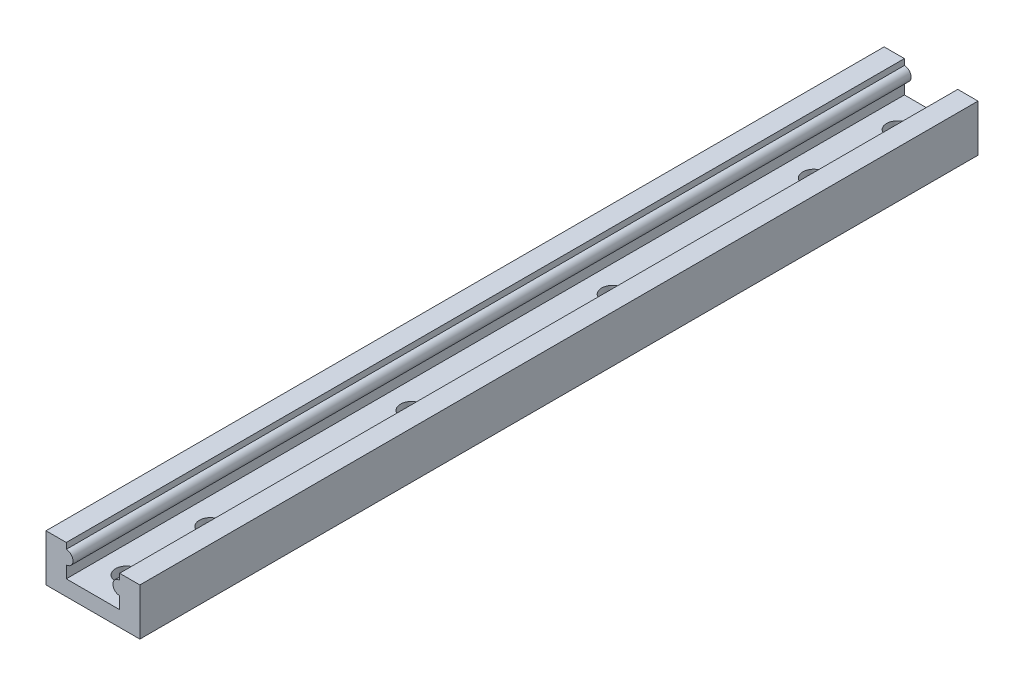
ISO-10303-21;
HEADER;
FILE_DESCRIPTION(('STEP AP214'),'2;1');
FILE_NAME('part.step','',(''),(''),'','','');
FILE_SCHEMA(('AUTOMOTIVE_DESIGN { 1 0 10303 214 1 1 1 1 }'));
ENDSEC;
DATA;
#1=APPLICATION_CONTEXT('core data for automotive mechanical design processes');
#2=APPLICATION_PROTOCOL_DEFINITION('international standard','automotive_design',2000,#1);
#3=PRODUCT_CONTEXT('',#1,'mechanical');
#4=PRODUCT('Part','Part','',(#3));
#5=PRODUCT_RELATED_PRODUCT_CATEGORY('part','',(#4));
#6=PRODUCT_DEFINITION_FORMATION('','',#4);
#7=PRODUCT_DEFINITION_CONTEXT('part definition',#1,'design');
#8=PRODUCT_DEFINITION('design','',#6,#7);
#9=PRODUCT_DEFINITION_SHAPE('','',#8);
#10=(LENGTH_UNIT() NAMED_UNIT(*) SI_UNIT(.MILLI.,.METRE.));
#11=(NAMED_UNIT(*) PLANE_ANGLE_UNIT() SI_UNIT($,.RADIAN.));
#12=(NAMED_UNIT(*) SI_UNIT($,.STERADIAN.) SOLID_ANGLE_UNIT());
#13=UNCERTAINTY_MEASURE_WITH_UNIT(LENGTH_MEASURE(1.E-05),#10,'distance_accuracy_value','');
#14=(GEOMETRIC_REPRESENTATION_CONTEXT(3) GLOBAL_UNCERTAINTY_ASSIGNED_CONTEXT((#13)) GLOBAL_UNIT_ASSIGNED_CONTEXT((#10,
#11,#12)) REPRESENTATION_CONTEXT('',''));
#15=CARTESIAN_POINT('',(0.,0.,0.));
#16=DIRECTION('',(0.,0.,1.));
#17=DIRECTION('',(1.,0.,0.));
#18=AXIS2_PLACEMENT_3D('',#15,#16,#17);
#19=CARTESIAN_POINT('',(7.95524904214564,8.16737698289642,10.));
#20=DIRECTION('',(0.,-1.,0.));
#21=DIRECTION('',(1.,0.,0.));
#22=AXIS2_PLACEMENT_3D('',#19,#20,#21);
#23=CYLINDRICAL_SURFACE('',#22,1.6);
#24=CARTESIAN_POINT('',(7.95524904214564,-5.83262301710358,10.));
#25=DIRECTION('',(0.,-1.,0.));
#26=DIRECTION('',(1.,0.,0.));
#27=AXIS2_PLACEMENT_3D('',#24,#25,#26);
#28=CIRCLE('',#27,1.6);
#29=CARTESIAN_POINT('',(9.55524904214564,-5.83262301710358,10.));
#30=VERTEX_POINT('',#29);
#31=EDGE_CURVE('E258',#30,#30,#28,.T.);
#32=ORIENTED_EDGE('',*,*,#31,.T.);
#33=EDGE_LOOP('',(#32));
#34=FACE_BOUND('',#33,.T.);
#35=CARTESIAN_POINT('',(7.95524904214564,-4.23262301710358,10.));
#36=DIRECTION('',(0.,1.,0.));
#37=DIRECTION('',(0.,0.,1.));
#38=AXIS2_PLACEMENT_3D('',#35,#36,#37);
#39=CIRCLE('',#38,1.6);
#40=CARTESIAN_POINT('',(7.95524904214564,-4.23262301710358,11.6));
#41=VERTEX_POINT('',#40);
#42=EDGE_CURVE('E38',#41,#41,#39,.F.);
#43=ORIENTED_EDGE('',*,*,#42,.F.);
#44=EDGE_LOOP('',(#43));
#45=FACE_BOUND('',#44,.T.);
#46=ADVANCED_FACE('F34',(#34,#45),#23,.F.);
#47=CARTESIAN_POINT('',(7.95524904214561,8.16737698289642,215.));
#48=DIRECTION('',(0.,-1.,0.));
#49=DIRECTION('',(1.,0.,0.));
#50=AXIS2_PLACEMENT_3D('',#47,#48,#49);
#51=CYLINDRICAL_SURFACE('',#50,1.75);
#52=CARTESIAN_POINT('',(7.95524904214561,-5.83262301710358,215.));
#53=DIRECTION('',(0.,-1.,0.));
#54=DIRECTION('',(1.,0.,0.));
#55=AXIS2_PLACEMENT_3D('',#52,#53,#54);
#56=CIRCLE('',#55,1.75);
#57=CARTESIAN_POINT('',(9.70524904214561,-5.83262301710358,215.));
#58=VERTEX_POINT('',#57);
#59=EDGE_CURVE('E161',#58,#58,#56,.T.);
#60=ORIENTED_EDGE('',*,*,#59,.T.);
#61=EDGE_LOOP('',(#60));
#62=FACE_BOUND('',#61,.T.);
#63=CARTESIAN_POINT('',(7.95524904214561,-4.23262301710358,215.));
#64=DIRECTION('',(0.,1.,0.));
#65=DIRECTION('',(0.,0.,1.));
#66=AXIS2_PLACEMENT_3D('',#63,#64,#65);
#67=CIRCLE('',#66,1.75);
#68=CARTESIAN_POINT('',(7.95524904214561,-4.23262301710358,216.75));
#69=VERTEX_POINT('',#68);
#70=EDGE_CURVE('E223',#69,#69,#67,.F.);
#71=ORIENTED_EDGE('',*,*,#70,.F.);
#72=EDGE_LOOP('',(#71));
#73=FACE_BOUND('',#72,.T.);
#74=ADVANCED_FACE('F313',(#62,#73),#51,.F.);
#75=CARTESIAN_POINT('',(7.95524904214645,8.16737698289642,155.));
#76=DIRECTION('',(0.,-1.,0.));
#77=DIRECTION('',(1.,0.,0.));
#78=AXIS2_PLACEMENT_3D('',#75,#76,#77);
#79=CYLINDRICAL_SURFACE('',#78,1.75);
#80=CARTESIAN_POINT('',(7.95524904214645,-5.83262301710358,155.));
#81=DIRECTION('',(0.,-1.,0.));
#82=DIRECTION('',(1.,0.,0.));
#83=AXIS2_PLACEMENT_3D('',#80,#81,#82);
#84=CIRCLE('',#83,1.75);
#85=CARTESIAN_POINT('',(9.70524904214645,-5.83262301710358,155.));
#86=VERTEX_POINT('',#85);
#87=EDGE_CURVE('E267',#86,#86,#84,.T.);
#88=ORIENTED_EDGE('',*,*,#87,.T.);
#89=EDGE_LOOP('',(#88));
#90=FACE_BOUND('',#89,.T.);
#91=CARTESIAN_POINT('',(7.95524904214645,-4.23262301710358,155.));
#92=DIRECTION('',(0.,1.,0.));
#93=DIRECTION('',(0.,0.,1.));
#94=AXIS2_PLACEMENT_3D('',#91,#92,#93);
#95=CIRCLE('',#94,1.75);
#96=CARTESIAN_POINT('',(7.95524904214645,-4.23262301710358,156.75));
#97=VERTEX_POINT('',#96);
#98=EDGE_CURVE('E219',#97,#97,#95,.F.);
#99=ORIENTED_EDGE('',*,*,#98,.F.);
#100=EDGE_LOOP('',(#99));
#101=FACE_BOUND('',#100,.T.);
#102=ADVANCED_FACE('F320',(#90,#101),#79,.F.);
#103=CARTESIAN_POINT('',(7.95524904214729,8.16737698289642,95.));
#104=DIRECTION('',(0.,-1.,0.));
#105=DIRECTION('',(1.,0.,0.));
#106=AXIS2_PLACEMENT_3D('',#103,#104,#105);
#107=CYLINDRICAL_SURFACE('',#106,1.75);
#108=CARTESIAN_POINT('',(7.95524904214729,-5.83262301710358,95.));
#109=DIRECTION('',(0.,-1.,0.));
#110=DIRECTION('',(1.,0.,0.));
#111=AXIS2_PLACEMENT_3D('',#108,#109,#110);
#112=CIRCLE('',#111,1.75);
#113=CARTESIAN_POINT('',(9.70524904214729,-5.83262301710358,95.));
#114=VERTEX_POINT('',#113);
#115=EDGE_CURVE('E264',#114,#114,#112,.T.);
#116=ORIENTED_EDGE('',*,*,#115,.T.);
#117=EDGE_LOOP('',(#116));
#118=FACE_BOUND('',#117,.T.);
#119=CARTESIAN_POINT('',(7.95524904214729,-4.23262301710358,95.));
#120=DIRECTION('',(0.,1.,0.));
#121=DIRECTION('',(0.,0.,1.));
#122=AXIS2_PLACEMENT_3D('',#119,#120,#121);
#123=CIRCLE('',#122,1.75);
#124=CARTESIAN_POINT('',(7.95524904214729,-4.23262301710358,96.75));
#125=VERTEX_POINT('',#124);
#126=EDGE_CURVE('E214',#125,#125,#123,.F.);
#127=ORIENTED_EDGE('',*,*,#126,.F.);
#128=EDGE_LOOP('',(#127));
#129=FACE_BOUND('',#128,.T.);
#130=ADVANCED_FACE('F332',(#118,#129),#107,.F.);
#131=CARTESIAN_POINT('',(7.95524904214561,8.16737698289642,240.));
#132=DIRECTION('',(0.,-1.,0.));
#133=DIRECTION('',(1.,0.,0.));
#134=AXIS2_PLACEMENT_3D('',#131,#132,#133);
#135=CYLINDRICAL_SURFACE('',#134,1.6);
#136=CARTESIAN_POINT('',(7.95524904214561,-5.83262301710358,240.));
#137=DIRECTION('',(0.,-1.,0.));
#138=DIRECTION('',(1.,0.,0.));
#139=AXIS2_PLACEMENT_3D('',#136,#137,#138);
#140=CIRCLE('',#139,1.6);
#141=CARTESIAN_POINT('',(9.5552490421456,-5.83262301710358,240.));
#142=VERTEX_POINT('',#141);
#143=EDGE_CURVE('E207',#142,#142,#140,.T.);
#144=ORIENTED_EDGE('',*,*,#143,.T.);
#145=EDGE_LOOP('',(#144));
#146=FACE_BOUND('',#145,.T.);
#147=CARTESIAN_POINT('',(7.95524904214561,-4.23262301710358,240.));
#148=DIRECTION('',(0.,1.,0.));
#149=DIRECTION('',(0.,0.,1.));
#150=AXIS2_PLACEMENT_3D('',#147,#148,#149);
#151=CIRCLE('',#150,1.6);
#152=CARTESIAN_POINT('',(7.95524904214561,-4.23262301710358,241.6));
#153=VERTEX_POINT('',#152);
#154=EDGE_CURVE('E209',#153,#153,#151,.F.);
#155=ORIENTED_EDGE('',*,*,#154,.F.);
#156=EDGE_LOOP('',(#155));
#157=FACE_BOUND('',#156,.T.);
#158=ADVANCED_FACE('F326',(#146,#157),#135,.F.);
#159=CARTESIAN_POINT('',(7.95524904214813,8.16737698289642,35.));
#160=DIRECTION('',(0.,-1.,0.));
#161=DIRECTION('',(1.,0.,0.));
#162=AXIS2_PLACEMENT_3D('',#159,#160,#161);
#163=CYLINDRICAL_SURFACE('',#162,1.75);
#164=CARTESIAN_POINT('',(7.95524904214813,-5.83262301710358,35.));
#165=DIRECTION('',(0.,-1.,0.));
#166=DIRECTION('',(1.,0.,0.));
#167=AXIS2_PLACEMENT_3D('',#164,#165,#166);
#168=CIRCLE('',#167,1.75);
#169=CARTESIAN_POINT('',(9.70524904214813,-5.83262301710358,35.));
#170=VERTEX_POINT('',#169);
#171=EDGE_CURVE('E261',#170,#170,#168,.T.);
#172=ORIENTED_EDGE('',*,*,#171,.T.);
#173=EDGE_LOOP('',(#172));
#174=FACE_BOUND('',#173,.T.);
#175=CARTESIAN_POINT('',(7.95524904214813,-4.23262301710358,35.));
#176=DIRECTION('',(0.,1.,0.));
#177=DIRECTION('',(0.,0.,1.));
#178=AXIS2_PLACEMENT_3D('',#175,#176,#177);
#179=CIRCLE('',#178,1.75);
#180=CARTESIAN_POINT('',(7.95524904214813,-4.23262301710358,36.75));
#181=VERTEX_POINT('',#180);
#182=EDGE_CURVE('E204',#181,#181,#179,.F.);
#183=ORIENTED_EDGE('',*,*,#182,.F.);
#184=EDGE_LOOP('',(#183));
#185=FACE_BOUND('',#184,.T.);
#186=ADVANCED_FACE('F328',(#174,#185),#163,.F.);
#187=CARTESIAN_POINT('',(-6.0447509578544,8.16737698289642,250.));
#188=DIRECTION('',(1.,0.,0.));
#189=DIRECTION('',(0.,1.,0.));
#190=AXIS2_PLACEMENT_3D('',#187,#188,#189);
#191=PLANE('',#190);
#192=DIRECTION('',(0.,-1.,0.));
#193=VECTOR('',#192,1.);
#194=CARTESIAN_POINT('',(-6.0447509578544,8.16737698289642,0.));
#195=LINE('',#194,#193);
#196=CARTESIAN_POINT('',(-6.0447509578544,8.16737698289642,0.));
#197=VERTEX_POINT('',#196);
#198=CARTESIAN_POINT('',(-6.04475095785439,-5.83262301710358,0.));
#199=VERTEX_POINT('',#198);
#200=EDGE_CURVE('E157',#197,#199,#195,.T.);
#201=ORIENTED_EDGE('',*,*,#200,.T.);
#202=DIRECTION('',(0.,0.,-1.));
#203=VECTOR('',#202,1.);
#204=CARTESIAN_POINT('',(-6.04475095785439,-5.83262301710358,250.));
#205=LINE('',#204,#203);
#206=CARTESIAN_POINT('',(-6.04475095785439,-5.83262301710358,250.));
#207=VERTEX_POINT('',#206);
#208=EDGE_CURVE('E11',#207,#199,#205,.T.);
#209=ORIENTED_EDGE('',*,*,#208,.F.);
#210=DIRECTION('',(0.,-1.,0.));
#211=VECTOR('',#210,1.);
#212=CARTESIAN_POINT('',(-6.0447509578544,8.16737698289642,250.));
#213=LINE('',#212,#211);
#214=CARTESIAN_POINT('',(-6.0447509578544,8.16737698289642,250.));
#215=VERTEX_POINT('',#214);
#216=EDGE_CURVE('E180',#215,#207,#213,.T.);
#217=ORIENTED_EDGE('',*,*,#216,.F.);
#218=DIRECTION('',(0.,0.,-1.));
#219=VECTOR('',#218,1.);
#220=CARTESIAN_POINT('',(-6.0447509578544,8.16737698289642,250.));
#221=LINE('',#220,#219);
#222=EDGE_CURVE('E153',#215,#197,#221,.T.);
#223=ORIENTED_EDGE('',*,*,#222,.T.);
#224=EDGE_LOOP('',(#201,#209,#217,#223));
#225=FACE_BOUND('',#224,.T.);
#226=ADVANCED_FACE('F36',(#225),#191,.F.);
#227=CARTESIAN_POINT('',(-6.04475095785439,-5.83262301710358,250.));
#228=DIRECTION('',(0.,1.,0.));
#229=DIRECTION('',(-1.,0.,0.));
#230=AXIS2_PLACEMENT_3D('',#227,#228,#229);
#231=PLANE('',#230);
#232=ORIENTED_EDGE('',*,*,#143,.F.);
#233=EDGE_LOOP('',(#232));
#234=FACE_BOUND('',#233,.T.);
#235=ORIENTED_EDGE('',*,*,#31,.F.);
#236=EDGE_LOOP('',(#235));
#237=FACE_BOUND('',#236,.T.);
#238=ORIENTED_EDGE('',*,*,#171,.F.);
#239=EDGE_LOOP('',(#238));
#240=FACE_BOUND('',#239,.T.);
#241=ORIENTED_EDGE('',*,*,#115,.F.);
#242=EDGE_LOOP('',(#241));
#243=FACE_BOUND('',#242,.T.);
#244=ORIENTED_EDGE('',*,*,#87,.F.);
#245=EDGE_LOOP('',(#244));
#246=FACE_BOUND('',#245,.T.);
#247=ORIENTED_EDGE('',*,*,#59,.F.);
#248=EDGE_LOOP('',(#247));
#249=FACE_BOUND('',#248,.T.);
#250=DIRECTION('',(1.,0.,0.));
#251=VECTOR('',#250,1.);
#252=CARTESIAN_POINT('',(-6.04475095785439,-5.83262301710358,0.));
#253=LINE('',#252,#251);
#254=CARTESIAN_POINT('',(21.9552490421456,-5.83262301710358,0.));
#255=VERTEX_POINT('',#254);
#256=EDGE_CURVE('E160',#199,#255,#253,.T.);
#257=ORIENTED_EDGE('',*,*,#256,.T.);
#258=DIRECTION('',(0.,0.,-1.));
#259=VECTOR('',#258,1.);
#260=CARTESIAN_POINT('',(21.9552490421456,-5.83262301710358,250.));
#261=LINE('',#260,#259);
#262=CARTESIAN_POINT('',(21.9552490421456,-5.83262301710358,250.));
#263=VERTEX_POINT('',#262);
#264=EDGE_CURVE('E44',#263,#255,#261,.T.);
#265=ORIENTED_EDGE('',*,*,#264,.F.);
#266=DIRECTION('',(1.,0.,0.));
#267=VECTOR('',#266,1.);
#268=CARTESIAN_POINT('',(-6.04475095785439,-5.83262301710358,250.));
#269=LINE('',#268,#267);
#270=EDGE_CURVE('E108',#207,#263,#269,.T.);
#271=ORIENTED_EDGE('',*,*,#270,.F.);
#272=ORIENTED_EDGE('',*,*,#208,.T.);
#273=EDGE_LOOP('',(#257,#265,#271,#272));
#274=FACE_BOUND('',#273,.T.);
#275=ADVANCED_FACE('F443',(#234,#237,#240,#243,#246,#249,#274),#231,.F.);
#276=CARTESIAN_POINT('',(21.9552490421456,8.16737698289642,250.));
#277=DIRECTION('',(-1.,0.,0.));
#278=DIRECTION('',(0.,0.,1.));
#279=AXIS2_PLACEMENT_3D('',#276,#277,#278);
#280=PLANE('',#279);
#281=DIRECTION('',(0.,1.,0.));
#282=VECTOR('',#281,1.);
#283=CARTESIAN_POINT('',(21.9552490421456,8.16737698289642,0.));
#284=LINE('',#283,#282);
#285=CARTESIAN_POINT('',(21.9552490421456,8.16737698289642,0.));
#286=VERTEX_POINT('',#285);
#287=EDGE_CURVE('E163',#255,#286,#284,.T.);
#288=ORIENTED_EDGE('',*,*,#287,.T.);
#289=DIRECTION('',(0.,0.,-1.));
#290=VECTOR('',#289,1.);
#291=CARTESIAN_POINT('',(21.9552490421456,8.16737698289642,250.));
#292=LINE('',#291,#290);
#293=CARTESIAN_POINT('',(21.9552490421456,8.16737698289642,250.));
#294=VERTEX_POINT('',#293);
#295=EDGE_CURVE('E199',#294,#286,#292,.T.);
#296=ORIENTED_EDGE('',*,*,#295,.F.);
#297=DIRECTION('',(0.,1.,0.));
#298=VECTOR('',#297,1.);
#299=CARTESIAN_POINT('',(21.9552490421456,8.16737698289642,250.));
#300=LINE('',#299,#298);
#301=EDGE_CURVE('E274',#263,#294,#300,.T.);
#302=ORIENTED_EDGE('',*,*,#301,.F.);
#303=ORIENTED_EDGE('',*,*,#264,.T.);
#304=EDGE_LOOP('',(#288,#296,#302,#303));
#305=FACE_BOUND('',#304,.T.);
#306=ADVANCED_FACE('F440',(#305),#280,.F.);
#307=CARTESIAN_POINT('',(15.9104980842912,8.16737698289642,250.));
#308=DIRECTION('',(0.,-1.,0.));
#309=DIRECTION('',(1.,0.,0.));
#310=AXIS2_PLACEMENT_3D('',#307,#308,#309);
#311=PLANE('',#310);
#312=DIRECTION('',(-1.,0.,0.));
#313=VECTOR('',#312,1.);
#314=CARTESIAN_POINT('',(15.9104980842912,8.16737698289642,0.));
#315=LINE('',#314,#313);
#316=CARTESIAN_POINT('',(15.9104980842912,8.16737698289642,0.));
#317=VERTEX_POINT('',#316);
#318=EDGE_CURVE('E165',#286,#317,#315,.T.);
#319=ORIENTED_EDGE('',*,*,#318,.T.);
#320=DIRECTION('',(0.,0.,-1.));
#321=VECTOR('',#320,1.);
#322=CARTESIAN_POINT('',(15.9104980842912,8.16737698289642,250.));
#323=LINE('',#322,#321);
#324=CARTESIAN_POINT('',(15.9104980842912,8.16737698289642,250.));
#325=VERTEX_POINT('',#324);
#326=EDGE_CURVE('E196',#325,#317,#323,.T.);
#327=ORIENTED_EDGE('',*,*,#326,.F.);
#328=DIRECTION('',(-1.,0.,0.));
#329=VECTOR('',#328,1.);
#330=CARTESIAN_POINT('',(15.9104980842912,8.16737698289642,250.));
#331=LINE('',#330,#329);
#332=EDGE_CURVE('E276',#294,#325,#331,.T.);
#333=ORIENTED_EDGE('',*,*,#332,.F.);
#334=ORIENTED_EDGE('',*,*,#295,.T.);
#335=EDGE_LOOP('',(#319,#327,#333,#334));
#336=FACE_BOUND('',#335,.T.);
#337=ADVANCED_FACE('F436',(#336),#311,.F.);
#338=CARTESIAN_POINT('',(15.9104980842912,8.16737698289642,250.));
#339=DIRECTION('',(1.,0.,0.));
#340=DIRECTION('',(0.,0.,-1.));
#341=AXIS2_PLACEMENT_3D('',#338,#339,#340);
#342=PLANE('',#341);
#343=DIRECTION('',(0.,-1.,0.));
#344=VECTOR('',#343,1.);
#345=CARTESIAN_POINT('',(15.9104980842912,8.16737698289642,0.));
#346=LINE('',#345,#344);
#347=CARTESIAN_POINT('',(15.9104980842912,6.37632974788739,0.));
#348=VERTEX_POINT('',#347);
#349=EDGE_CURVE('E167',#317,#348,#346,.T.);
#350=ORIENTED_EDGE('',*,*,#349,.T.);
#351=DIRECTION('',(0.,0.,-1.));
#352=VECTOR('',#351,1.);
#353=CARTESIAN_POINT('',(15.9104980842912,6.37632974788739,250.));
#354=LINE('',#353,#352);
#355=CARTESIAN_POINT('',(15.9104980842912,6.37632974788739,250.));
#356=VERTEX_POINT('',#355);
#357=EDGE_CURVE('E193',#356,#348,#354,.T.);
#358=ORIENTED_EDGE('',*,*,#357,.F.);
#359=DIRECTION('',(0.,-1.,0.));
#360=VECTOR('',#359,1.);
#361=CARTESIAN_POINT('',(15.9104980842912,8.16737698289642,250.));
#362=LINE('',#361,#360);
#363=EDGE_CURVE('E278',#325,#356,#362,.T.);
#364=ORIENTED_EDGE('',*,*,#363,.F.);
#365=ORIENTED_EDGE('',*,*,#326,.T.);
#366=EDGE_LOOP('',(#350,#358,#364,#365));
#367=FACE_BOUND('',#366,.T.);
#368=ADVANCED_FACE('F432',(#367),#342,.F.);
#369=CARTESIAN_POINT('',(15.9104980842912,4.37632974788739,250.));
#370=DIRECTION('',(0.,0.,-1.));
#371=DIRECTION('',(-1.,0.,0.));
#372=AXIS2_PLACEMENT_3D('',#369,#370,#371);
#373=CYLINDRICAL_SURFACE('',#372,2.);
#374=CARTESIAN_POINT('',(15.9104980842912,4.37632974788739,0.));
#375=DIRECTION('',(0.,0.,1.));
#376=DIRECTION('',(-1.,0.,0.));
#377=AXIS2_PLACEMENT_3D('',#374,#375,#376);
#378=CIRCLE('',#377,2.);
#379=CARTESIAN_POINT('',(15.9104980842912,2.37632974788739,0.));
#380=VERTEX_POINT('',#379);
#381=EDGE_CURVE('E169',#348,#380,#378,.T.);
#382=ORIENTED_EDGE('',*,*,#381,.T.);
#383=DIRECTION('',(0.,0.,-1.));
#384=VECTOR('',#383,1.);
#385=CARTESIAN_POINT('',(15.9104980842912,2.37632974788739,250.));
#386=LINE('',#385,#384);
#387=CARTESIAN_POINT('',(15.9104980842912,2.37632974788739,250.));
#388=VERTEX_POINT('',#387);
#389=EDGE_CURVE('E190',#388,#380,#386,.T.);
#390=ORIENTED_EDGE('',*,*,#389,.F.);
#391=CARTESIAN_POINT('',(15.9104980842912,4.37632974788739,250.));
#392=DIRECTION('',(0.,0.,1.));
#393=DIRECTION('',(-1.,0.,0.));
#394=AXIS2_PLACEMENT_3D('',#391,#392,#393);
#395=CIRCLE('',#394,2.);
#396=EDGE_CURVE('E280',#356,#388,#395,.T.);
#397=ORIENTED_EDGE('',*,*,#396,.F.);
#398=ORIENTED_EDGE('',*,*,#357,.T.);
#399=EDGE_LOOP('',(#382,#390,#397,#398));
#400=FACE_BOUND('',#399,.T.);
#401=ADVANCED_FACE('F425',(#400),#373,.T.);
#402=CARTESIAN_POINT('',(15.9104980842912,2.37632974788739,250.));
#403=DIRECTION('',(1.,0.,0.));
#404=DIRECTION('',(0.,1.,0.));
#405=AXIS2_PLACEMENT_3D('',#402,#403,#404);
#406=PLANE('',#405);
#407=DIRECTION('',(0.,-1.,0.));
#408=VECTOR('',#407,1.);
#409=CARTESIAN_POINT('',(15.9104980842912,2.37632974788739,0.));
#410=LINE('',#409,#408);
#411=CARTESIAN_POINT('',(15.9104980842912,-1.23262301710358,0.));
#412=VERTEX_POINT('',#411);
#413=EDGE_CURVE('E171',#380,#412,#410,.T.);
#414=ORIENTED_EDGE('',*,*,#413,.T.);
#415=DIRECTION('',(0.,0.,-1.));
#416=VECTOR('',#415,1.);
#417=CARTESIAN_POINT('',(15.9104980842912,-1.23262301710358,250.));
#418=LINE('',#417,#416);
#419=CARTESIAN_POINT('',(15.9104980842912,-1.23262301710358,250.));
#420=VERTEX_POINT('',#419);
#421=EDGE_CURVE('E187',#420,#412,#418,.T.);
#422=ORIENTED_EDGE('',*,*,#421,.F.);
#423=DIRECTION('',(0.,-1.,0.));
#424=VECTOR('',#423,1.);
#425=CARTESIAN_POINT('',(15.9104980842912,2.37632974788739,250.));
#426=LINE('',#425,#424);
#427=EDGE_CURVE('E282',#388,#420,#426,.T.);
#428=ORIENTED_EDGE('',*,*,#427,.F.);
#429=ORIENTED_EDGE('',*,*,#389,.T.);
#430=EDGE_LOOP('',(#414,#422,#428,#429));
#431=FACE_BOUND('',#430,.T.);
#432=ADVANCED_FACE('F403',(#431),#406,.F.);
#433=CARTESIAN_POINT('',(0.,-1.23262301710358,250.));
#434=DIRECTION('',(0.,-1.,0.));
#435=DIRECTION('',(0.,0.,-1.));
#436=AXIS2_PLACEMENT_3D('',#433,#434,#435);
#437=PLANE('',#436);
#438=CARTESIAN_POINT('',(7.95524904214564,-1.23262301710358,10.));
#439=DIRECTION('',(0.,1.,0.));
#440=DIRECTION('',(0.,0.,1.));
#441=AXIS2_PLACEMENT_3D('',#438,#439,#440);
#442=CIRCLE('',#441,3.25);
#443=CARTESIAN_POINT('',(7.95524904214564,-1.23262301710358,13.25));
#444=VERTEX_POINT('',#443);
#445=EDGE_CURVE('E239',#444,#444,#442,.T.);
#446=ORIENTED_EDGE('',*,*,#445,.F.);
#447=EDGE_LOOP('',(#446));
#448=FACE_BOUND('',#447,.T.);
#449=CARTESIAN_POINT('',(7.95524904212332,-1.23262301710358,215.));
#450=DIRECTION('',(0.,1.,0.));
#451=DIRECTION('',(0.,0.,1.));
#452=AXIS2_PLACEMENT_3D('',#449,#450,#451);
#453=CIRCLE('',#452,3.25);
#454=CARTESIAN_POINT('',(7.95524904212332,-1.23262301710358,218.25));
#455=VERTEX_POINT('',#454);
#456=EDGE_CURVE('E232',#455,#455,#453,.T.);
#457=ORIENTED_EDGE('',*,*,#456,.F.);
#458=EDGE_LOOP('',(#457));
#459=FACE_BOUND('',#458,.T.);
#460=CARTESIAN_POINT('',(7.95524904213159,-1.23262301710358,155.));
#461=DIRECTION('',(0.,1.,0.));
#462=DIRECTION('',(0.,0.,1.));
#463=AXIS2_PLACEMENT_3D('',#460,#461,#462);
#464=CIRCLE('',#463,3.25);
#465=CARTESIAN_POINT('',(7.95524904213159,-1.23262301710358,158.25));
#466=VERTEX_POINT('',#465);
#467=EDGE_CURVE('E225',#466,#466,#464,.T.);
#468=ORIENTED_EDGE('',*,*,#467,.F.);
#469=EDGE_LOOP('',(#468));
#470=FACE_BOUND('',#469,.T.);
#471=CARTESIAN_POINT('',(7.95524904213986,-1.23262301710358,95.));
#472=DIRECTION('',(0.,1.,0.));
#473=DIRECTION('',(0.,0.,1.));
#474=AXIS2_PLACEMENT_3D('',#471,#472,#473);
#475=CIRCLE('',#474,3.25);
#476=CARTESIAN_POINT('',(7.95524904213986,-1.23262301710358,98.25));
#477=VERTEX_POINT('',#476);
#478=EDGE_CURVE('E221',#477,#477,#475,.T.);
#479=ORIENTED_EDGE('',*,*,#478,.F.);
#480=EDGE_LOOP('',(#479));
#481=FACE_BOUND('',#480,.T.);
#482=CARTESIAN_POINT('',(7.95524904214561,-1.23262301710358,240.));
#483=DIRECTION('',(0.,1.,0.));
#484=DIRECTION('',(0.,0.,1.));
#485=AXIS2_PLACEMENT_3D('',#482,#483,#484);
#486=CIRCLE('',#485,3.25);
#487=CARTESIAN_POINT('',(7.95524904214561,-1.23262301710358,243.25));
#488=VERTEX_POINT('',#487);
#489=EDGE_CURVE('E217',#488,#488,#486,.T.);
#490=ORIENTED_EDGE('',*,*,#489,.F.);
#491=EDGE_LOOP('',(#490));
#492=FACE_BOUND('',#491,.T.);
#493=CARTESIAN_POINT('',(7.95524904214813,-1.23262301710358,35.));
#494=DIRECTION('',(0.,1.,0.));
#495=DIRECTION('',(0.,0.,1.));
#496=AXIS2_PLACEMENT_3D('',#493,#494,#495);
#497=CIRCLE('',#496,3.25);
#498=CARTESIAN_POINT('',(7.95524904214813,-1.23262301710358,38.25));
#499=VERTEX_POINT('',#498);
#500=EDGE_CURVE('E212',#499,#499,#497,.T.);
#501=ORIENTED_EDGE('',*,*,#500,.F.);
#502=EDGE_LOOP('',(#501));
#503=FACE_BOUND('',#502,.T.);
#504=DIRECTION('',(-1.,0.,0.));
#505=VECTOR('',#504,1.);
#506=CARTESIAN_POINT('',(0.,-1.23262301710358,0.));
#507=LINE('',#506,#505);
#508=CARTESIAN_POINT('',(0.,-1.23262301710358,0.));
#509=VERTEX_POINT('',#508);
#510=EDGE_CURVE('E173',#412,#509,#507,.T.);
#511=ORIENTED_EDGE('',*,*,#510,.T.);
#512=DIRECTION('',(0.,0.,-1.));
#513=VECTOR('',#512,1.);
#514=CARTESIAN_POINT('',(0.,-1.23262301710358,250.));
#515=LINE('',#514,#513);
#516=CARTESIAN_POINT('',(0.,-1.23262301710358,250.));
#517=VERTEX_POINT('',#516);
#518=EDGE_CURVE('E184',#517,#509,#515,.T.);
#519=ORIENTED_EDGE('',*,*,#518,.F.);
#520=DIRECTION('',(-1.,0.,0.));
#521=VECTOR('',#520,1.);
#522=CARTESIAN_POINT('',(0.,-1.23262301710358,250.));
#523=LINE('',#522,#521);
#524=EDGE_CURVE('E284',#420,#517,#523,.T.);
#525=ORIENTED_EDGE('',*,*,#524,.F.);
#526=ORIENTED_EDGE('',*,*,#421,.T.);
#527=EDGE_LOOP('',(#511,#519,#525,#526));
#528=FACE_BOUND('',#527,.T.);
#529=ADVANCED_FACE('F290',(#448,#459,#470,#481,#492,#503,#528),#437,.F.);
#530=CARTESIAN_POINT('',(0.,2.37632974788739,250.));
#531=DIRECTION('',(-1.,0.,0.));
#532=DIRECTION('',(0.,0.,1.));
#533=AXIS2_PLACEMENT_3D('',#530,#531,#532);
#534=PLANE('',#533);
#535=DIRECTION('',(0.,1.,0.));
#536=VECTOR('',#535,1.);
#537=CARTESIAN_POINT('',(0.,2.37632974788739,0.));
#538=LINE('',#537,#536);
#539=CARTESIAN_POINT('',(0.,2.37632974788739,0.));
#540=VERTEX_POINT('',#539);
#541=EDGE_CURVE('E175',#509,#540,#538,.T.);
#542=ORIENTED_EDGE('',*,*,#541,.T.);
#543=DIRECTION('',(0.,0.,-1.));
#544=VECTOR('',#543,1.);
#545=CARTESIAN_POINT('',(0.,2.37632974788739,250.));
#546=LINE('',#545,#544);
#547=CARTESIAN_POINT('',(0.,2.37632974788739,250.));
#548=VERTEX_POINT('',#547);
#549=EDGE_CURVE('E148',#548,#540,#546,.T.);
#550=ORIENTED_EDGE('',*,*,#549,.F.);
#551=DIRECTION('',(0.,1.,0.));
#552=VECTOR('',#551,1.);
#553=CARTESIAN_POINT('',(0.,2.37632974788739,250.));
#554=LINE('',#553,#552);
#555=EDGE_CURVE('E139',#517,#548,#554,.T.);
#556=ORIENTED_EDGE('',*,*,#555,.F.);
#557=ORIENTED_EDGE('',*,*,#518,.T.);
#558=EDGE_LOOP('',(#542,#550,#556,#557));
#559=FACE_BOUND('',#558,.T.);
#560=ADVANCED_FACE('F294',(#559),#534,.F.);
#561=CARTESIAN_POINT('',(0.,4.37632974788739,250.));
#562=DIRECTION('',(0.,0.,-1.));
#563=DIRECTION('',(-1.,0.,0.));
#564=AXIS2_PLACEMENT_3D('',#561,#562,#563);
#565=CYLINDRICAL_SURFACE('',#564,2.);
#566=CARTESIAN_POINT('',(0.,4.37632974788739,0.));
#567=DIRECTION('',(0.,0.,1.));
#568=DIRECTION('',(1.,0.,0.));
#569=AXIS2_PLACEMENT_3D('',#566,#567,#568);
#570=CIRCLE('',#569,2.);
#571=CARTESIAN_POINT('',(0.,6.37632974788739,0.));
#572=VERTEX_POINT('',#571);
#573=EDGE_CURVE('E147',#540,#572,#570,.T.);
#574=ORIENTED_EDGE('',*,*,#573,.T.);
#575=DIRECTION('',(0.,0.,-1.));
#576=VECTOR('',#575,1.);
#577=CARTESIAN_POINT('',(0.,6.37632974788739,250.));
#578=LINE('',#577,#576);
#579=CARTESIAN_POINT('',(0.,6.37632974788739,250.));
#580=VERTEX_POINT('',#579);
#581=EDGE_CURVE('E144',#580,#572,#578,.T.);
#582=ORIENTED_EDGE('',*,*,#581,.F.);
#583=CARTESIAN_POINT('',(0.,4.37632974788739,250.));
#584=DIRECTION('',(0.,0.,1.));
#585=DIRECTION('',(1.,0.,0.));
#586=AXIS2_PLACEMENT_3D('',#583,#584,#585);
#587=CIRCLE('',#586,2.);
#588=EDGE_CURVE('E133',#548,#580,#587,.T.);
#589=ORIENTED_EDGE('',*,*,#588,.F.);
#590=ORIENTED_EDGE('',*,*,#549,.T.);
#591=EDGE_LOOP('',(#574,#582,#589,#590));
#592=FACE_BOUND('',#591,.T.);
#593=ADVANCED_FACE('F145',(#592),#565,.T.);
#594=CARTESIAN_POINT('',(0.,8.16737698289642,250.));
#595=DIRECTION('',(-1.,0.,0.));
#596=DIRECTION('',(0.,0.,1.));
#597=AXIS2_PLACEMENT_3D('',#594,#595,#596);
#598=PLANE('',#597);
#599=DIRECTION('',(0.,1.,0.));
#600=VECTOR('',#599,1.);
#601=CARTESIAN_POINT('',(0.,8.16737698289642,0.));
#602=LINE('',#601,#600);
#603=CARTESIAN_POINT('',(0.,8.16737698289642,0.));
#604=VERTEX_POINT('',#603);
#605=EDGE_CURVE('E94',#572,#604,#602,.T.);
#606=ORIENTED_EDGE('',*,*,#605,.T.);
#607=DIRECTION('',(0.,0.,-1.));
#608=VECTOR('',#607,1.);
#609=CARTESIAN_POINT('',(0.,8.16737698289642,250.));
#610=LINE('',#609,#608);
#611=CARTESIAN_POINT('',(0.,8.16737698289642,250.));
#612=VERTEX_POINT('',#611);
#613=EDGE_CURVE('E149',#612,#604,#610,.T.);
#614=ORIENTED_EDGE('',*,*,#613,.F.);
#615=DIRECTION('',(0.,1.,0.));
#616=VECTOR('',#615,1.);
#617=CARTESIAN_POINT('',(0.,8.16737698289642,250.));
#618=LINE('',#617,#616);
#619=EDGE_CURVE('E137',#580,#612,#618,.T.);
#620=ORIENTED_EDGE('',*,*,#619,.F.);
#621=ORIENTED_EDGE('',*,*,#581,.T.);
#622=EDGE_LOOP('',(#606,#614,#620,#621));
#623=FACE_BOUND('',#622,.T.);
#624=ADVANCED_FACE('F151',(#623),#598,.F.);
#625=CARTESIAN_POINT('',(-6.0447509578544,8.16737698289642,250.));
#626=DIRECTION('',(0.,-1.,0.));
#627=DIRECTION('',(0.,0.,-1.));
#628=AXIS2_PLACEMENT_3D('',#625,#626,#627);
#629=PLANE('',#628);
#630=DIRECTION('',(-1.,0.,0.));
#631=VECTOR('',#630,1.);
#632=CARTESIAN_POINT('',(-6.0447509578544,8.16737698289642,0.));
#633=LINE('',#632,#631);
#634=EDGE_CURVE('E100',#604,#197,#633,.T.);
#635=ORIENTED_EDGE('',*,*,#634,.T.);
#636=ORIENTED_EDGE('',*,*,#222,.F.);
#637=DIRECTION('',(-1.,0.,0.));
#638=VECTOR('',#637,1.);
#639=CARTESIAN_POINT('',(-6.0447509578544,8.16737698289642,250.));
#640=LINE('',#639,#638);
#641=EDGE_CURVE('E53',#612,#215,#640,.T.);
#642=ORIENTED_EDGE('',*,*,#641,.F.);
#643=ORIENTED_EDGE('',*,*,#613,.T.);
#644=EDGE_LOOP('',(#635,#636,#642,#643));
#645=FACE_BOUND('',#644,.T.);
#646=ADVANCED_FACE('F302',(#645),#629,.F.);
#647=CARTESIAN_POINT('',(15.9104980842912,4.37632974788739,250.));
#648=DIRECTION('',(0.,0.,-1.));
#649=DIRECTION('',(-1.,0.,0.));
#650=AXIS2_PLACEMENT_3D('',#647,#648,#649);
#651=PLANE('',#650);
#652=ORIENTED_EDGE('',*,*,#216,.T.);
#653=ORIENTED_EDGE('',*,*,#270,.T.);
#654=ORIENTED_EDGE('',*,*,#301,.T.);
#655=ORIENTED_EDGE('',*,*,#332,.T.);
#656=ORIENTED_EDGE('',*,*,#363,.T.);
#657=ORIENTED_EDGE('',*,*,#396,.T.);
#658=ORIENTED_EDGE('',*,*,#427,.T.);
#659=ORIENTED_EDGE('',*,*,#524,.T.);
#660=ORIENTED_EDGE('',*,*,#555,.T.);
#661=ORIENTED_EDGE('',*,*,#588,.T.);
#662=ORIENTED_EDGE('',*,*,#619,.T.);
#663=ORIENTED_EDGE('',*,*,#641,.T.);
#664=EDGE_LOOP('',(#652,#653,#654,#655,#656,#657,#658,#659,#660,#661,#662,#663));
#665=FACE_BOUND('',#664,.T.);
#666=ADVANCED_FACE('F135',(#665),#651,.F.);
#667=CARTESIAN_POINT('',(15.9104980842912,4.37632974788739,0.));
#668=DIRECTION('',(0.,0.,-1.));
#669=DIRECTION('',(-1.,0.,0.));
#670=AXIS2_PLACEMENT_3D('',#667,#668,#669);
#671=PLANE('',#670);
#672=ORIENTED_EDGE('',*,*,#200,.F.);
#673=ORIENTED_EDGE('',*,*,#634,.F.);
#674=ORIENTED_EDGE('',*,*,#605,.F.);
#675=ORIENTED_EDGE('',*,*,#573,.F.);
#676=ORIENTED_EDGE('',*,*,#541,.F.);
#677=ORIENTED_EDGE('',*,*,#510,.F.);
#678=ORIENTED_EDGE('',*,*,#413,.F.);
#679=ORIENTED_EDGE('',*,*,#381,.F.);
#680=ORIENTED_EDGE('',*,*,#349,.F.);
#681=ORIENTED_EDGE('',*,*,#318,.F.);
#682=ORIENTED_EDGE('',*,*,#287,.F.);
#683=ORIENTED_EDGE('',*,*,#256,.F.);
#684=EDGE_LOOP('',(#672,#673,#674,#675,#676,#677,#678,#679,#680,#681,#682,#683));
#685=FACE_BOUND('',#684,.T.);
#686=ADVANCED_FACE('F297',(#685),#671,.T.);
#687=CARTESIAN_POINT('',(7.95524904214813,-4.23262301710358,35.));
#688=DIRECTION('',(0.,1.,0.));
#689=DIRECTION('',(0.,0.,1.));
#690=AXIS2_PLACEMENT_3D('',#687,#688,#689);
#691=PLANE('',#690);
#692=CARTESIAN_POINT('',(7.95524904214813,-4.23262301710358,35.));
#693=DIRECTION('',(0.,1.,0.));
#694=DIRECTION('',(0.,0.,1.));
#695=AXIS2_PLACEMENT_3D('',#692,#693,#694);
#696=CIRCLE('',#695,3.25);
#697=CARTESIAN_POINT('',(7.95524904214813,-4.23262301710358,38.25));
#698=VERTEX_POINT('',#697);
#699=EDGE_CURVE('E208',#698,#698,#696,.T.);
#700=ORIENTED_EDGE('',*,*,#699,.T.);
#701=EDGE_LOOP('',(#700));
#702=FACE_BOUND('',#701,.T.);
#703=ORIENTED_EDGE('',*,*,#182,.T.);
#704=EDGE_LOOP('',(#703));
#705=FACE_BOUND('',#704,.T.);
#706=ADVANCED_FACE('F338',(#702,#705),#691,.T.);
#707=CARTESIAN_POINT('',(7.95524904214813,-4.23262301710358,35.));
#708=DIRECTION('',(0.,1.,0.));
#709=DIRECTION('',(0.,0.,1.));
#710=AXIS2_PLACEMENT_3D('',#707,#708,#709);
#711=CYLINDRICAL_SURFACE('',#710,3.25);
#712=ORIENTED_EDGE('',*,*,#699,.F.);
#713=EDGE_LOOP('',(#712));
#714=FACE_BOUND('',#713,.T.);
#715=ORIENTED_EDGE('',*,*,#500,.T.);
#716=EDGE_LOOP('',(#715));
#717=FACE_BOUND('',#716,.T.);
#718=ADVANCED_FACE('F342',(#714,#717),#711,.F.);
#719=CARTESIAN_POINT('',(7.95524904214561,-4.23262301710358,240.));
#720=DIRECTION('',(0.,1.,0.));
#721=DIRECTION('',(0.,0.,1.));
#722=AXIS2_PLACEMENT_3D('',#719,#720,#721);
#723=PLANE('',#722);
#724=CARTESIAN_POINT('',(7.95524904214561,-4.23262301710358,240.));
#725=DIRECTION('',(0.,1.,0.));
#726=DIRECTION('',(0.,0.,1.));
#727=AXIS2_PLACEMENT_3D('',#724,#725,#726);
#728=CIRCLE('',#727,3.25);
#729=CARTESIAN_POINT('',(7.95524904214561,-4.23262301710358,243.25));
#730=VERTEX_POINT('',#729);
#731=EDGE_CURVE('E213',#730,#730,#728,.T.);
#732=ORIENTED_EDGE('',*,*,#731,.T.);
#733=EDGE_LOOP('',(#732));
#734=FACE_BOUND('',#733,.T.);
#735=ORIENTED_EDGE('',*,*,#154,.T.);
#736=EDGE_LOOP('',(#735));
#737=FACE_BOUND('',#736,.T.);
#738=ADVANCED_FACE('F348',(#734,#737),#723,.T.);
#739=CARTESIAN_POINT('',(7.95524904214561,-4.23262301710358,240.));
#740=DIRECTION('',(0.,1.,0.));
#741=DIRECTION('',(0.,0.,1.));
#742=AXIS2_PLACEMENT_3D('',#739,#740,#741);
#743=CYLINDRICAL_SURFACE('',#742,3.25);
#744=ORIENTED_EDGE('',*,*,#731,.F.);
#745=EDGE_LOOP('',(#744));
#746=FACE_BOUND('',#745,.T.);
#747=ORIENTED_EDGE('',*,*,#489,.T.);
#748=EDGE_LOOP('',(#747));
#749=FACE_BOUND('',#748,.T.);
#750=ADVANCED_FACE('F352',(#746,#749),#743,.F.);
#751=CARTESIAN_POINT('',(7.95524904213986,-4.23262301710358,95.));
#752=DIRECTION('',(0.,1.,0.));
#753=DIRECTION('',(0.,0.,1.));
#754=AXIS2_PLACEMENT_3D('',#751,#752,#753);
#755=PLANE('',#754);
#756=CARTESIAN_POINT('',(7.95524904213986,-4.23262301710358,95.));
#757=DIRECTION('',(0.,1.,0.));
#758=DIRECTION('',(0.,0.,1.));
#759=AXIS2_PLACEMENT_3D('',#756,#757,#758);
#760=CIRCLE('',#759,3.25);
#761=CARTESIAN_POINT('',(7.95524904213986,-4.23262301710358,98.25));
#762=VERTEX_POINT('',#761);
#763=EDGE_CURVE('E218',#762,#762,#760,.T.);
#764=ORIENTED_EDGE('',*,*,#763,.T.);
#765=EDGE_LOOP('',(#764));
#766=FACE_BOUND('',#765,.T.);
#767=ORIENTED_EDGE('',*,*,#126,.T.);
#768=EDGE_LOOP('',(#767));
#769=FACE_BOUND('',#768,.T.);
#770=ADVANCED_FACE('F355',(#766,#769),#755,.T.);
#771=CARTESIAN_POINT('',(7.95524904213986,-4.23262301710358,95.));
#772=DIRECTION('',(0.,1.,0.));
#773=DIRECTION('',(0.,0.,1.));
#774=AXIS2_PLACEMENT_3D('',#771,#772,#773);
#775=CYLINDRICAL_SURFACE('',#774,3.25);
#776=ORIENTED_EDGE('',*,*,#763,.F.);
#777=EDGE_LOOP('',(#776));
#778=FACE_BOUND('',#777,.T.);
#779=ORIENTED_EDGE('',*,*,#478,.T.);
#780=EDGE_LOOP('',(#779));
#781=FACE_BOUND('',#780,.T.);
#782=ADVANCED_FACE('F360',(#778,#781),#775,.F.);
#783=CARTESIAN_POINT('',(7.95524904213159,-4.23262301710358,155.));
#784=DIRECTION('',(0.,1.,0.));
#785=DIRECTION('',(0.,0.,1.));
#786=AXIS2_PLACEMENT_3D('',#783,#784,#785);
#787=PLANE('',#786);
#788=CARTESIAN_POINT('',(7.95524904213159,-4.23262301710358,155.));
#789=DIRECTION('',(0.,1.,0.));
#790=DIRECTION('',(0.,0.,1.));
#791=AXIS2_PLACEMENT_3D('',#788,#789,#790);
#792=CIRCLE('',#791,3.25);
#793=CARTESIAN_POINT('',(7.95524904213159,-4.23262301710358,158.25));
#794=VERTEX_POINT('',#793);
#795=EDGE_CURVE('E222',#794,#794,#792,.T.);
#796=ORIENTED_EDGE('',*,*,#795,.T.);
#797=EDGE_LOOP('',(#796));
#798=FACE_BOUND('',#797,.T.);
#799=ORIENTED_EDGE('',*,*,#98,.T.);
#800=EDGE_LOOP('',(#799));
#801=FACE_BOUND('',#800,.T.);
#802=ADVANCED_FACE('F363',(#798,#801),#787,.T.);
#803=CARTESIAN_POINT('',(7.95524904213159,-4.23262301710358,155.));
#804=DIRECTION('',(0.,1.,0.));
#805=DIRECTION('',(0.,0.,1.));
#806=AXIS2_PLACEMENT_3D('',#803,#804,#805);
#807=CYLINDRICAL_SURFACE('',#806,3.25);
#808=ORIENTED_EDGE('',*,*,#795,.F.);
#809=EDGE_LOOP('',(#808));
#810=FACE_BOUND('',#809,.T.);
#811=ORIENTED_EDGE('',*,*,#467,.T.);
#812=EDGE_LOOP('',(#811));
#813=FACE_BOUND('',#812,.T.);
#814=ADVANCED_FACE('F368',(#810,#813),#807,.F.);
#815=CARTESIAN_POINT('',(7.95524904212332,-4.23262301710358,215.));
#816=DIRECTION('',(0.,1.,0.));
#817=DIRECTION('',(0.,0.,1.));
#818=AXIS2_PLACEMENT_3D('',#815,#816,#817);
#819=PLANE('',#818);
#820=CARTESIAN_POINT('',(7.95524904212332,-4.23262301710358,215.));
#821=DIRECTION('',(0.,1.,0.));
#822=DIRECTION('',(0.,0.,1.));
#823=AXIS2_PLACEMENT_3D('',#820,#821,#822);
#824=CIRCLE('',#823,3.25);
#825=CARTESIAN_POINT('',(7.95524904212332,-4.23262301710358,218.25));
#826=VERTEX_POINT('',#825);
#827=EDGE_CURVE('E226',#826,#826,#824,.T.);
#828=ORIENTED_EDGE('',*,*,#827,.T.);
#829=EDGE_LOOP('',(#828));
#830=FACE_BOUND('',#829,.T.);
#831=ORIENTED_EDGE('',*,*,#70,.T.);
#832=EDGE_LOOP('',(#831));
#833=FACE_BOUND('',#832,.T.);
#834=ADVANCED_FACE('F371',(#830,#833),#819,.T.);
#835=CARTESIAN_POINT('',(7.95524904212332,-4.23262301710358,215.));
#836=DIRECTION('',(0.,1.,0.));
#837=DIRECTION('',(0.,0.,1.));
#838=AXIS2_PLACEMENT_3D('',#835,#836,#837);
#839=CYLINDRICAL_SURFACE('',#838,3.25);
#840=ORIENTED_EDGE('',*,*,#827,.F.);
#841=EDGE_LOOP('',(#840));
#842=FACE_BOUND('',#841,.T.);
#843=ORIENTED_EDGE('',*,*,#456,.T.);
#844=EDGE_LOOP('',(#843));
#845=FACE_BOUND('',#844,.T.);
#846=ADVANCED_FACE('F376',(#842,#845),#839,.F.);
#847=CARTESIAN_POINT('',(7.95524904214564,-4.23262301710358,10.));
#848=DIRECTION('',(0.,1.,0.));
#849=DIRECTION('',(0.,0.,1.));
#850=AXIS2_PLACEMENT_3D('',#847,#848,#849);
#851=PLANE('',#850);
#852=CARTESIAN_POINT('',(7.95524904214564,-4.23262301710358,10.));
#853=DIRECTION('',(0.,1.,0.));
#854=DIRECTION('',(0.,0.,1.));
#855=AXIS2_PLACEMENT_3D('',#852,#853,#854);
#856=CIRCLE('',#855,3.25);
#857=CARTESIAN_POINT('',(7.95524904214564,-4.23262301710358,13.25));
#858=VERTEX_POINT('',#857);
#859=EDGE_CURVE('E394',#858,#858,#856,.T.);
#860=ORIENTED_EDGE('',*,*,#859,.T.);
#861=EDGE_LOOP('',(#860));
#862=FACE_BOUND('',#861,.T.);
#863=ORIENTED_EDGE('',*,*,#42,.T.);
#864=EDGE_LOOP('',(#863));
#865=FACE_BOUND('',#864,.T.);
#866=ADVANCED_FACE('F379',(#862,#865),#851,.T.);
#867=CARTESIAN_POINT('',(7.95524904214564,-4.23262301710358,10.));
#868=DIRECTION('',(0.,1.,0.));
#869=DIRECTION('',(0.,0.,1.));
#870=AXIS2_PLACEMENT_3D('',#867,#868,#869);
#871=CYLINDRICAL_SURFACE('',#870,3.25);
#872=ORIENTED_EDGE('',*,*,#859,.F.);
#873=EDGE_LOOP('',(#872));
#874=FACE_BOUND('',#873,.T.);
#875=ORIENTED_EDGE('',*,*,#445,.T.);
#876=EDGE_LOOP('',(#875));
#877=FACE_BOUND('',#876,.T.);
#878=ADVANCED_FACE('F383',(#874,#877),#871,.F.);
#879=CLOSED_SHELL('',(#46,#74,#102,#130,#158,#186,#226,#275,#306,#337,#368,#401,#432,#529,#560,
#593,#624,#646,#666,#686,#706,#718,#738,#750,#770,#782,#802,#814,#834,#846,#866,#878));
#880=MANIFOLD_SOLID_BREP('B2',#879);
#881=ADVANCED_BREP_SHAPE_REPRESENTATION('',(#18,#880),#14);
#882=SHAPE_DEFINITION_REPRESENTATION(#9,#881);
ENDSEC;
END-ISO-10303-21;
